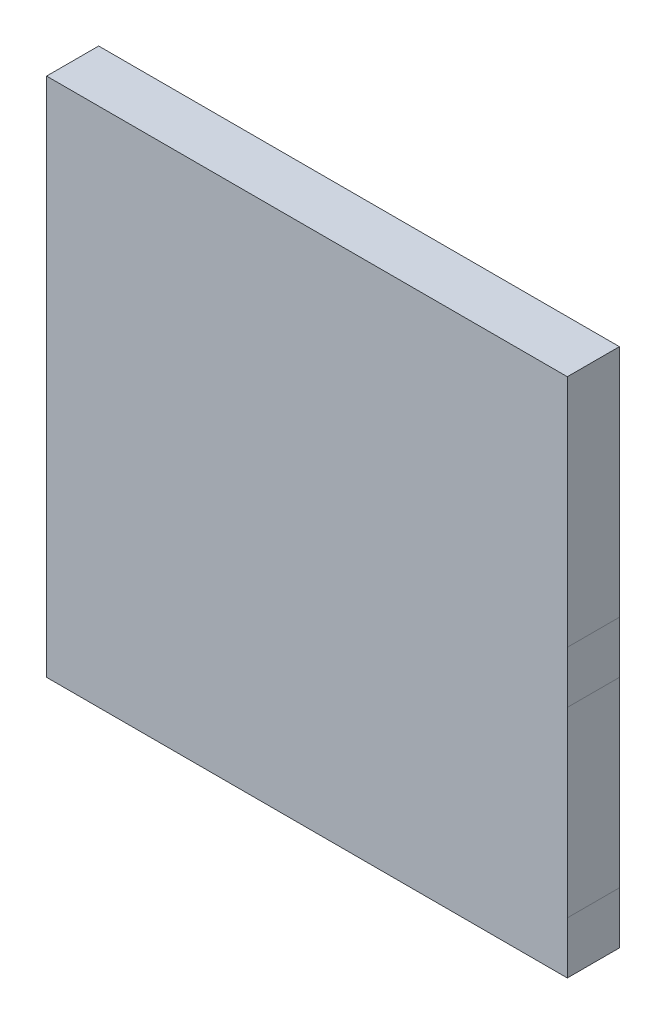
ISO-10303-21;
HEADER;
FILE_DESCRIPTION(('STEP AP214'),'2;1');
FILE_NAME('part.step','',(''),(''),'','','');
FILE_SCHEMA(('AUTOMOTIVE_DESIGN { 1 0 10303 214 1 1 1 1 }'));
ENDSEC;
DATA;
#1=APPLICATION_CONTEXT('core data for automotive mechanical design processes');
#2=APPLICATION_PROTOCOL_DEFINITION('international standard','automotive_design',2000,#1);
#3=PRODUCT_CONTEXT('',#1,'mechanical');
#4=PRODUCT('Part','Part','',(#3));
#5=PRODUCT_RELATED_PRODUCT_CATEGORY('part','',(#4));
#6=PRODUCT_DEFINITION_FORMATION('','',#4);
#7=PRODUCT_DEFINITION_CONTEXT('part definition',#1,'design');
#8=PRODUCT_DEFINITION('design','',#6,#7);
#9=PRODUCT_DEFINITION_SHAPE('','',#8);
#10=(LENGTH_UNIT() NAMED_UNIT(*) SI_UNIT(.MILLI.,.METRE.));
#11=(NAMED_UNIT(*) PLANE_ANGLE_UNIT() SI_UNIT($,.RADIAN.));
#12=(NAMED_UNIT(*) SI_UNIT($,.STERADIAN.) SOLID_ANGLE_UNIT());
#13=UNCERTAINTY_MEASURE_WITH_UNIT(LENGTH_MEASURE(1.E-05),#10,'distance_accuracy_value','');
#14=(GEOMETRIC_REPRESENTATION_CONTEXT(3) GLOBAL_UNCERTAINTY_ASSIGNED_CONTEXT((#13)) GLOBAL_UNIT_ASSIGNED_CONTEXT((#10,
#11,#12)) REPRESENTATION_CONTEXT('',''));
#15=CARTESIAN_POINT('',(0.,0.,0.));
#16=DIRECTION('',(0.,0.,1.));
#17=DIRECTION('',(1.,0.,0.));
#18=AXIS2_PLACEMENT_3D('',#15,#16,#17);
#19=CARTESIAN_POINT('',(1000.,0.,100.));
#20=DIRECTION('',(-1.,0.,0.));
#21=DIRECTION('',(0.,0.,1.));
#22=AXIS2_PLACEMENT_3D('',#19,#20,#21);
#23=PLANE('',#22);
#24=DIRECTION('',(0.,0.,-1.));
#25=VECTOR('',#24,1.);
#26=CARTESIAN_POINT('',(1000.,550.,100.));
#27=LINE('',#26,#25);
#28=CARTESIAN_POINT('',(1000.,550.,100.));
#29=VERTEX_POINT('',#28);
#30=CARTESIAN_POINT('',(1000.,550.,0.));
#31=VERTEX_POINT('',#30);
#32=EDGE_CURVE('E11',#29,#31,#27,.T.);
#33=ORIENTED_EDGE('',*,*,#32,.F.);
#34=DIRECTION('',(0.,1.,0.));
#35=VECTOR('',#34,1.);
#36=CARTESIAN_POINT('',(1000.,0.,100.));
#37=LINE('',#36,#35);
#38=CARTESIAN_POINT('',(1000.,450.,100.));
#39=VERTEX_POINT('',#38);
#40=EDGE_CURVE('E134',#39,#29,#37,.T.);
#41=ORIENTED_EDGE('',*,*,#40,.F.);
#42=DIRECTION('',(0.,0.,-1.));
#43=VECTOR('',#42,1.);
#44=CARTESIAN_POINT('',(1000.,450.,100.));
#45=LINE('',#44,#43);
#46=CARTESIAN_POINT('',(1000.,450.,0.));
#47=VERTEX_POINT('',#46);
#48=EDGE_CURVE('E48',#39,#47,#45,.T.);
#49=ORIENTED_EDGE('',*,*,#48,.T.);
#50=DIRECTION('',(0.,1.,0.));
#51=VECTOR('',#50,1.);
#52=CARTESIAN_POINT('',(1000.,0.,0.));
#53=LINE('',#52,#51);
#54=EDGE_CURVE('E132',#47,#31,#53,.T.);
#55=ORIENTED_EDGE('',*,*,#54,.T.);
#56=EDGE_LOOP('',(#33,#41,#49,#55));
#57=FACE_BOUND('',#56,.T.);
#58=ADVANCED_FACE('F39',(#57),#23,.F.);
#59=ORIENTED_EDGE('',*,*,#48,.F.);
#60=CARTESIAN_POINT('',(1000.,100.,100.));
#61=VERTEX_POINT('',#60);
#62=EDGE_CURVE('E163',#61,#39,#37,.T.);
#63=ORIENTED_EDGE('',*,*,#62,.F.);
#64=DIRECTION('',(0.,0.,-1.));
#65=VECTOR('',#64,1.);
#66=CARTESIAN_POINT('',(1000.,100.,100.));
#67=LINE('',#66,#65);
#68=CARTESIAN_POINT('',(1000.,100.,0.));
#69=VERTEX_POINT('',#68);
#70=EDGE_CURVE('E121',#61,#69,#67,.T.);
#71=ORIENTED_EDGE('',*,*,#70,.T.);
#72=EDGE_CURVE('E143',#69,#47,#53,.T.);
#73=ORIENTED_EDGE('',*,*,#72,.T.);
#74=EDGE_LOOP('',(#59,#63,#71,#73));
#75=FACE_BOUND('',#74,.T.);
#76=ADVANCED_FACE('F148',(#75),#23,.F.);
#77=ORIENTED_EDGE('',*,*,#70,.F.);
#78=CARTESIAN_POINT('',(1000.,0.,100.));
#79=VERTEX_POINT('',#78);
#80=EDGE_CURVE('E162',#79,#61,#37,.T.);
#81=ORIENTED_EDGE('',*,*,#80,.F.);
#82=DIRECTION('',(0.,0.,-1.));
#83=VECTOR('',#82,1.);
#84=CARTESIAN_POINT('',(1000.,0.,100.));
#85=LINE('',#84,#83);
#86=CARTESIAN_POINT('',(1000.,0.,0.));
#87=VERTEX_POINT('',#86);
#88=EDGE_CURVE('E103',#79,#87,#85,.T.);
#89=ORIENTED_EDGE('',*,*,#88,.T.);
#90=EDGE_CURVE('E149',#87,#69,#53,.T.);
#91=ORIENTED_EDGE('',*,*,#90,.T.);
#92=EDGE_LOOP('',(#77,#81,#89,#91));
#93=FACE_BOUND('',#92,.T.);
#94=ADVANCED_FACE('F167',(#93),#23,.F.);
#95=CARTESIAN_POINT('',(0.,0.,100.));
#96=DIRECTION('',(1.,0.,0.));
#97=DIRECTION('',(0.,0.,-1.));
#98=AXIS2_PLACEMENT_3D('',#95,#96,#97);
#99=PLANE('',#98);
#100=DIRECTION('',(0.,-1.,0.));
#101=VECTOR('',#100,1.);
#102=CARTESIAN_POINT('',(0.,0.,0.));
#103=LINE('',#102,#101);
#104=CARTESIAN_POINT('',(0.,1000.,0.));
#105=VERTEX_POINT('',#104);
#106=CARTESIAN_POINT('',(0.,0.,0.));
#107=VERTEX_POINT('',#106);
#108=EDGE_CURVE('E120',#105,#107,#103,.T.);
#109=ORIENTED_EDGE('',*,*,#108,.T.);
#110=DIRECTION('',(0.,0.,-1.));
#111=VECTOR('',#110,1.);
#112=CARTESIAN_POINT('',(0.,0.,100.));
#113=LINE('',#112,#111);
#114=CARTESIAN_POINT('',(0.,0.,100.));
#115=VERTEX_POINT('',#114);
#116=EDGE_CURVE('E100',#115,#107,#113,.T.);
#117=ORIENTED_EDGE('',*,*,#116,.F.);
#118=DIRECTION('',(0.,-1.,0.));
#119=VECTOR('',#118,1.);
#120=CARTESIAN_POINT('',(0.,0.,100.));
#121=LINE('',#120,#119);
#122=CARTESIAN_POINT('',(0.,1000.,100.));
#123=VERTEX_POINT('',#122);
#124=EDGE_CURVE('E108',#123,#115,#121,.T.);
#125=ORIENTED_EDGE('',*,*,#124,.F.);
#126=DIRECTION('',(0.,0.,-1.));
#127=VECTOR('',#126,1.);
#128=CARTESIAN_POINT('',(0.,1000.,100.));
#129=LINE('',#128,#127);
#130=EDGE_CURVE('E155',#123,#105,#129,.T.);
#131=ORIENTED_EDGE('',*,*,#130,.T.);
#132=EDGE_LOOP('',(#109,#117,#125,#131));
#133=FACE_BOUND('',#132,.T.);
#134=ADVANCED_FACE('F41',(#133),#99,.F.);
#135=CARTESIAN_POINT('',(0.,0.,100.));
#136=DIRECTION('',(0.,1.,0.));
#137=DIRECTION('',(0.,0.,1.));
#138=AXIS2_PLACEMENT_3D('',#135,#136,#137);
#139=PLANE('',#138);
#140=DIRECTION('',(1.,0.,0.));
#141=VECTOR('',#140,1.);
#142=CARTESIAN_POINT('',(0.,0.,0.));
#143=LINE('',#142,#141);
#144=EDGE_CURVE('E152',#107,#87,#143,.T.);
#145=ORIENTED_EDGE('',*,*,#144,.T.);
#146=ORIENTED_EDGE('',*,*,#88,.F.);
#147=DIRECTION('',(1.,0.,0.));
#148=VECTOR('',#147,1.);
#149=CARTESIAN_POINT('',(0.,0.,100.));
#150=LINE('',#149,#148);
#151=EDGE_CURVE('E96',#115,#79,#150,.T.);
#152=ORIENTED_EDGE('',*,*,#151,.F.);
#153=ORIENTED_EDGE('',*,*,#116,.T.);
#154=EDGE_LOOP('',(#145,#146,#152,#153));
#155=FACE_BOUND('',#154,.T.);
#156=ADVANCED_FACE('F98',(#155),#139,.F.);
#157=CARTESIAN_POINT('',(1000.,1000.,100.));
#158=VERTEX_POINT('',#157);
#159=EDGE_CURVE('E107',#29,#158,#37,.T.);
#160=ORIENTED_EDGE('',*,*,#159,.F.);
#161=ORIENTED_EDGE('',*,*,#32,.T.);
#162=CARTESIAN_POINT('',(1000.,1000.,0.));
#163=VERTEX_POINT('',#162);
#164=EDGE_CURVE('E146',#31,#163,#53,.T.);
#165=ORIENTED_EDGE('',*,*,#164,.T.);
#166=DIRECTION('',(0.,0.,-1.));
#167=VECTOR('',#166,1.);
#168=CARTESIAN_POINT('',(1000.,1000.,100.));
#169=LINE('',#168,#167);
#170=EDGE_CURVE('E125',#158,#163,#169,.T.);
#171=ORIENTED_EDGE('',*,*,#170,.F.);
#172=EDGE_LOOP('',(#160,#161,#165,#171));
#173=FACE_BOUND('',#172,.T.);
#174=ADVANCED_FACE('F164',(#173),#23,.F.);
#175=CARTESIAN_POINT('',(0.,1000.,100.));
#176=DIRECTION('',(0.,-1.,0.));
#177=DIRECTION('',(0.,0.,-1.));
#178=AXIS2_PLACEMENT_3D('',#175,#176,#177);
#179=PLANE('',#178);
#180=DIRECTION('',(-1.,0.,0.));
#181=VECTOR('',#180,1.);
#182=CARTESIAN_POINT('',(0.,1000.,0.));
#183=LINE('',#182,#181);
#184=EDGE_CURVE('E117',#163,#105,#183,.T.);
#185=ORIENTED_EDGE('',*,*,#184,.T.);
#186=ORIENTED_EDGE('',*,*,#130,.F.);
#187=DIRECTION('',(-1.,0.,0.));
#188=VECTOR('',#187,1.);
#189=CARTESIAN_POINT('',(0.,1000.,100.));
#190=LINE('',#189,#188);
#191=EDGE_CURVE('E113',#158,#123,#190,.T.);
#192=ORIENTED_EDGE('',*,*,#191,.F.);
#193=ORIENTED_EDGE('',*,*,#170,.T.);
#194=EDGE_LOOP('',(#185,#186,#192,#193));
#195=FACE_BOUND('',#194,.T.);
#196=ADVANCED_FACE('F159',(#195),#179,.F.);
#197=CARTESIAN_POINT('',(0.,0.,100.));
#198=DIRECTION('',(0.,0.,-1.));
#199=DIRECTION('',(-1.,0.,0.));
#200=AXIS2_PLACEMENT_3D('',#197,#198,#199);
#201=PLANE('',#200);
#202=ORIENTED_EDGE('',*,*,#124,.T.);
#203=ORIENTED_EDGE('',*,*,#151,.T.);
#204=ORIENTED_EDGE('',*,*,#80,.T.);
#205=ORIENTED_EDGE('',*,*,#62,.T.);
#206=ORIENTED_EDGE('',*,*,#40,.T.);
#207=ORIENTED_EDGE('',*,*,#159,.T.);
#208=ORIENTED_EDGE('',*,*,#191,.T.);
#209=EDGE_LOOP('',(#202,#203,#204,#205,#206,#207,#208));
#210=FACE_BOUND('',#209,.T.);
#211=ADVANCED_FACE('F111',(#210),#201,.F.);
#212=CARTESIAN_POINT('',(0.,0.,0.));
#213=DIRECTION('',(0.,0.,-1.));
#214=DIRECTION('',(-1.,0.,0.));
#215=AXIS2_PLACEMENT_3D('',#212,#213,#214);
#216=PLANE('',#215);
#217=ORIENTED_EDGE('',*,*,#108,.F.);
#218=ORIENTED_EDGE('',*,*,#184,.F.);
#219=ORIENTED_EDGE('',*,*,#164,.F.);
#220=ORIENTED_EDGE('',*,*,#54,.F.);
#221=ORIENTED_EDGE('',*,*,#72,.F.);
#222=ORIENTED_EDGE('',*,*,#90,.F.);
#223=ORIENTED_EDGE('',*,*,#144,.F.);
#224=EDGE_LOOP('',(#217,#218,#219,#220,#221,#222,#223));
#225=FACE_BOUND('',#224,.T.);
#226=ADVANCED_FACE('F141',(#225),#216,.T.);
#227=CLOSED_SHELL('',(#58,#76,#94,#134,#156,#174,#196,#211,#226));
#228=MANIFOLD_SOLID_BREP('B2',#227);
#229=ADVANCED_BREP_SHAPE_REPRESENTATION('',(#18,#228),#14);
#230=SHAPE_DEFINITION_REPRESENTATION(#9,#229);
ENDSEC;
END-ISO-10303-21;
